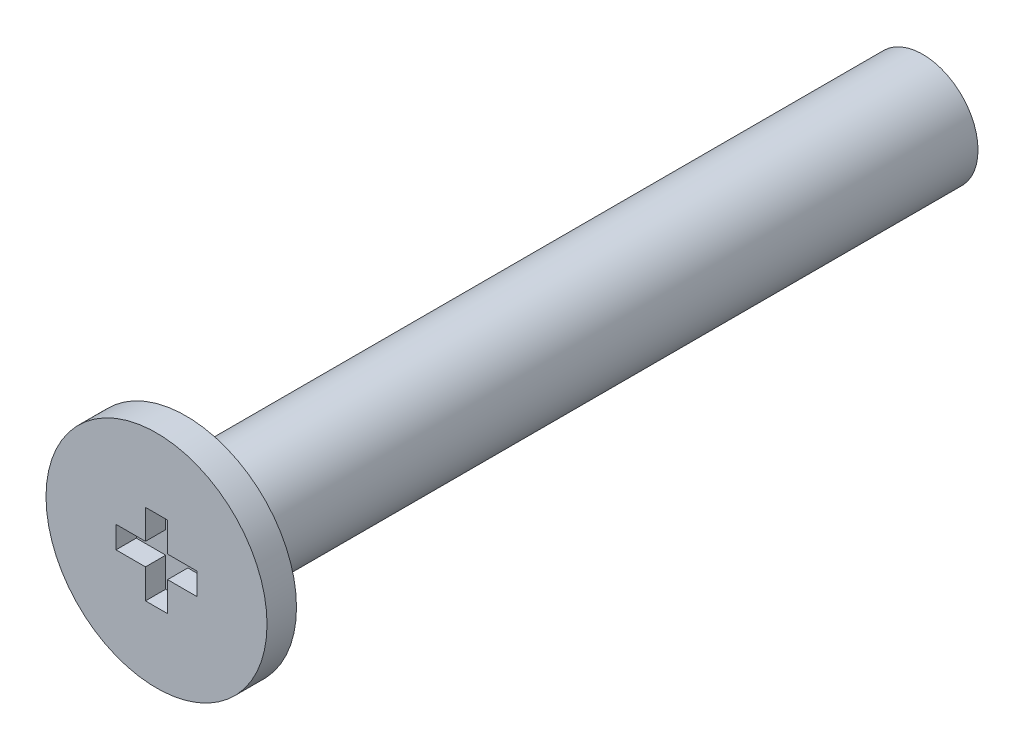
ISO-10303-21;
HEADER;
FILE_DESCRIPTION(('STEP AP214'),'2;1');
FILE_NAME('part.step','',(''),(''),'','','');
FILE_SCHEMA(('AUTOMOTIVE_DESIGN { 1 0 10303 214 1 1 1 1 }'));
ENDSEC;
DATA;
#1=APPLICATION_CONTEXT('core data for automotive mechanical design processes');
#2=APPLICATION_PROTOCOL_DEFINITION('international standard','automotive_design',2000,#1);
#3=PRODUCT_CONTEXT('',#1,'mechanical');
#4=PRODUCT('Part','Part','',(#3));
#5=PRODUCT_RELATED_PRODUCT_CATEGORY('part','',(#4));
#6=PRODUCT_DEFINITION_FORMATION('','',#4);
#7=PRODUCT_DEFINITION_CONTEXT('part definition',#1,'design');
#8=PRODUCT_DEFINITION('design','',#6,#7);
#9=PRODUCT_DEFINITION_SHAPE('','',#8);
#10=(LENGTH_UNIT() NAMED_UNIT(*) SI_UNIT(.MILLI.,.METRE.));
#11=(NAMED_UNIT(*) PLANE_ANGLE_UNIT() SI_UNIT($,.RADIAN.));
#12=(NAMED_UNIT(*) SI_UNIT($,.STERADIAN.) SOLID_ANGLE_UNIT());
#13=UNCERTAINTY_MEASURE_WITH_UNIT(LENGTH_MEASURE(1.E-05),#10,'distance_accuracy_value','');
#14=(GEOMETRIC_REPRESENTATION_CONTEXT(3) GLOBAL_UNCERTAINTY_ASSIGNED_CONTEXT((#13)) GLOBAL_UNIT_ASSIGNED_CONTEXT((#10,
#11,#12)) REPRESENTATION_CONTEXT('',''));
#15=CARTESIAN_POINT('',(0.,0.,0.));
#16=DIRECTION('',(0.,0.,1.));
#17=DIRECTION('',(1.,0.,0.));
#18=AXIS2_PLACEMENT_3D('',#15,#16,#17);
#19=CARTESIAN_POINT('',(0.,0.,-20.));
#20=DIRECTION('',(0.,0.,1.));
#21=DIRECTION('',(1.,0.,0.));
#22=AXIS2_PLACEMENT_3D('',#19,#20,#21);
#23=CYLINDRICAL_SURFACE('',#22,1.5);
#24=CARTESIAN_POINT('',(0.,0.,-20.));
#25=DIRECTION('',(0.,0.,1.));
#26=DIRECTION('',(1.,0.,0.));
#27=AXIS2_PLACEMENT_3D('',#24,#25,#26);
#28=CIRCLE('',#27,1.5);
#29=CARTESIAN_POINT('',(1.5,0.,-20.));
#30=VERTEX_POINT('',#29);
#31=EDGE_CURVE('E212',#30,#30,#28,.T.);
#32=ORIENTED_EDGE('',*,*,#31,.T.);
#33=EDGE_LOOP('',(#32));
#34=FACE_BOUND('',#33,.T.);
#35=CARTESIAN_POINT('',(0.,0.,0.));
#36=DIRECTION('',(0.,0.,1.));
#37=DIRECTION('',(1.,0.,0.));
#38=AXIS2_PLACEMENT_3D('',#35,#36,#37);
#39=CIRCLE('',#38,1.5);
#40=CARTESIAN_POINT('',(1.5,0.,0.));
#41=VERTEX_POINT('',#40);
#42=EDGE_CURVE('E208',#41,#41,#39,.T.);
#43=ORIENTED_EDGE('',*,*,#42,.F.);
#44=EDGE_LOOP('',(#43));
#45=FACE_BOUND('',#44,.T.);
#46=ADVANCED_FACE('F41',(#34,#45),#23,.T.);
#47=CARTESIAN_POINT('',(0.,0.,-20.));
#48=DIRECTION('',(0.,0.,1.));
#49=DIRECTION('',(1.,0.,0.));
#50=AXIS2_PLACEMENT_3D('',#47,#48,#49);
#51=PLANE('',#50);
#52=ORIENTED_EDGE('',*,*,#31,.F.);
#53=EDGE_LOOP('',(#52));
#54=FACE_BOUND('',#53,.T.);
#55=ADVANCED_FACE('F281',(#54),#51,.F.);
#56=CARTESIAN_POINT('',(0.,0.,0.));
#57=DIRECTION('',(0.,0.,1.));
#58=DIRECTION('',(1.,0.,0.));
#59=AXIS2_PLACEMENT_3D('',#56,#57,#58);
#60=PLANE('',#59);
#61=ORIENTED_EDGE('',*,*,#42,.T.);
#62=EDGE_LOOP('',(#61));
#63=FACE_BOUND('',#62,.T.);
#64=CARTESIAN_POINT('',(0.,0.,0.));
#65=DIRECTION('',(0.,0.,-1.));
#66=DIRECTION('',(-1.,0.,0.));
#67=AXIS2_PLACEMENT_3D('',#64,#65,#66);
#68=CIRCLE('',#67,3.);
#69=CARTESIAN_POINT('',(-3.,0.,0.));
#70=VERTEX_POINT('',#69);
#71=EDGE_CURVE('E210',#70,#70,#68,.T.);
#72=ORIENTED_EDGE('',*,*,#71,.T.);
#73=EDGE_LOOP('',(#72));
#74=FACE_BOUND('',#73,.T.);
#75=ADVANCED_FACE('F286',(#63,#74),#60,.F.);
#76=CARTESIAN_POINT('',(0.,0.,-2.));
#77=DIRECTION('',(0.,0.,-1.));
#78=DIRECTION('',(-1.,0.,0.));
#79=AXIS2_PLACEMENT_3D('',#76,#77,#78);
#80=CYLINDRICAL_SURFACE('',#79,3.);
#81=ORIENTED_EDGE('',*,*,#71,.F.);
#82=EDGE_LOOP('',(#81));
#83=FACE_BOUND('',#82,.T.);
#84=CARTESIAN_POINT('',(0.,0.,0.8));
#85=DIRECTION('',(0.,0.,-1.));
#86=DIRECTION('',(-1.,0.,0.));
#87=AXIS2_PLACEMENT_3D('',#84,#85,#86);
#88=CIRCLE('',#87,3.);
#89=CARTESIAN_POINT('',(-3.,0.,0.8));
#90=VERTEX_POINT('',#89);
#91=EDGE_CURVE('E180',#90,#90,#88,.T.);
#92=ORIENTED_EDGE('',*,*,#91,.T.);
#93=EDGE_LOOP('',(#92));
#94=FACE_BOUND('',#93,.T.);
#95=ADVANCED_FACE('F300',(#83,#94),#80,.T.);
#96=CARTESIAN_POINT('',(3.,0.,0.8));
#97=DIRECTION('',(0.,0.,-1.));
#98=DIRECTION('',(-1.,0.,0.));
#99=AXIS2_PLACEMENT_3D('',#96,#97,#98);
#100=PLANE('',#99);
#101=DIRECTION('',(-1.,0.,0.));
#102=VECTOR('',#101,1.);
#103=CARTESIAN_POINT('',(3.,-1.1,0.8));
#104=LINE('',#103,#102);
#105=CARTESIAN_POINT('',(0.3,-1.1,0.8));
#106=VERTEX_POINT('',#105);
#107=CARTESIAN_POINT('',(-0.3,-1.1,0.8));
#108=VERTEX_POINT('',#107);
#109=EDGE_CURVE('E211',#106,#108,#104,.T.);
#110=ORIENTED_EDGE('',*,*,#109,.T.);
#111=DIRECTION('',(0.,1.,0.));
#112=VECTOR('',#111,1.);
#113=CARTESIAN_POINT('',(-0.3,0.,0.8));
#114=LINE('',#113,#112);
#115=CARTESIAN_POINT('',(-0.3,-0.3,0.8));
#116=VERTEX_POINT('',#115);
#117=EDGE_CURVE('E11',#108,#116,#114,.T.);
#118=ORIENTED_EDGE('',*,*,#117,.T.);
#119=DIRECTION('',(-1.,0.,0.));
#120=VECTOR('',#119,1.);
#121=CARTESIAN_POINT('',(3.,-0.3,0.8));
#122=LINE('',#121,#120);
#123=CARTESIAN_POINT('',(-1.1,-0.3,0.8));
#124=VERTEX_POINT('',#123);
#125=EDGE_CURVE('E48',#116,#124,#122,.T.);
#126=ORIENTED_EDGE('',*,*,#125,.T.);
#127=DIRECTION('',(0.,1.,0.));
#128=VECTOR('',#127,1.);
#129=CARTESIAN_POINT('',(-1.1,0.,0.8));
#130=LINE('',#129,#128);
#131=CARTESIAN_POINT('',(-1.1,0.3,0.8));
#132=VERTEX_POINT('',#131);
#133=EDGE_CURVE('E245',#124,#132,#130,.T.);
#134=ORIENTED_EDGE('',*,*,#133,.T.);
#135=DIRECTION('',(1.,0.,0.));
#136=VECTOR('',#135,1.);
#137=CARTESIAN_POINT('',(3.,0.3,0.8));
#138=LINE('',#137,#136);
#139=CARTESIAN_POINT('',(-0.3,0.3,0.8));
#140=VERTEX_POINT('',#139);
#141=EDGE_CURVE('E236',#132,#140,#138,.T.);
#142=ORIENTED_EDGE('',*,*,#141,.T.);
#143=DIRECTION('',(0.,1.,0.));
#144=VECTOR('',#143,1.);
#145=CARTESIAN_POINT('',(-0.3,0.,0.8));
#146=LINE('',#145,#144);
#147=CARTESIAN_POINT('',(-0.3,1.1,0.8));
#148=VERTEX_POINT('',#147);
#149=EDGE_CURVE('E237',#140,#148,#146,.T.);
#150=ORIENTED_EDGE('',*,*,#149,.T.);
#151=DIRECTION('',(1.,0.,0.));
#152=VECTOR('',#151,1.);
#153=CARTESIAN_POINT('',(3.,1.1,0.8));
#154=LINE('',#153,#152);
#155=CARTESIAN_POINT('',(0.3,1.1,0.8));
#156=VERTEX_POINT('',#155);
#157=EDGE_CURVE('E231',#148,#156,#154,.T.);
#158=ORIENTED_EDGE('',*,*,#157,.T.);
#159=DIRECTION('',(0.,-1.,0.));
#160=VECTOR('',#159,1.);
#161=CARTESIAN_POINT('',(0.3,0.,0.8));
#162=LINE('',#161,#160);
#163=CARTESIAN_POINT('',(0.3,0.3,0.8));
#164=VERTEX_POINT('',#163);
#165=EDGE_CURVE('E229',#156,#164,#162,.T.);
#166=ORIENTED_EDGE('',*,*,#165,.T.);
#167=DIRECTION('',(1.,0.,0.));
#168=VECTOR('',#167,1.);
#169=CARTESIAN_POINT('',(3.,0.3,0.8));
#170=LINE('',#169,#168);
#171=CARTESIAN_POINT('',(1.1,0.3,0.8));
#172=VERTEX_POINT('',#171);
#173=EDGE_CURVE('E230',#164,#172,#170,.T.);
#174=ORIENTED_EDGE('',*,*,#173,.T.);
#175=DIRECTION('',(0.,-1.,0.));
#176=VECTOR('',#175,1.);
#177=CARTESIAN_POINT('',(1.1,0.,0.8));
#178=LINE('',#177,#176);
#179=CARTESIAN_POINT('',(1.1,-0.3,0.8));
#180=VERTEX_POINT('',#179);
#181=EDGE_CURVE('E224',#172,#180,#178,.T.);
#182=ORIENTED_EDGE('',*,*,#181,.T.);
#183=DIRECTION('',(-1.,0.,0.));
#184=VECTOR('',#183,1.);
#185=CARTESIAN_POINT('',(3.,-0.3,0.8));
#186=LINE('',#185,#184);
#187=CARTESIAN_POINT('',(0.3,-0.3,0.8));
#188=VERTEX_POINT('',#187);
#189=EDGE_CURVE('E222',#180,#188,#186,.T.);
#190=ORIENTED_EDGE('',*,*,#189,.T.);
#191=DIRECTION('',(0.,-1.,0.));
#192=VECTOR('',#191,1.);
#193=CARTESIAN_POINT('',(0.3,0.,0.8));
#194=LINE('',#193,#192);
#195=EDGE_CURVE('E217',#188,#106,#194,.T.);
#196=ORIENTED_EDGE('',*,*,#195,.T.);
#197=EDGE_LOOP('',(#110,#118,#126,#134,#142,#150,#158,#166,#174,#182,#190,#196));
#198=FACE_BOUND('',#197,.T.);
#199=ORIENTED_EDGE('',*,*,#91,.F.);
#200=EDGE_LOOP('',(#199));
#201=FACE_BOUND('',#200,.T.);
#202=ADVANCED_FACE('F244',(#198,#201),#100,.F.);
#203=CARTESIAN_POINT('',(-0.3,-0.3,0.25));
#204=DIRECTION('',(-1.,0.,0.));
#205=DIRECTION('',(0.,0.,1.));
#206=AXIS2_PLACEMENT_3D('',#203,#204,#205);
#207=PLANE('',#206);
#208=DIRECTION('',(0.,0.,1.));
#209=VECTOR('',#208,1.);
#210=CARTESIAN_POINT('',(-0.3,-1.1,0.25));
#211=LINE('',#210,#209);
#212=CARTESIAN_POINT('',(-0.3,-1.1,0.25));
#213=VERTEX_POINT('',#212);
#214=EDGE_CURVE('E54',#213,#108,#211,.T.);
#215=ORIENTED_EDGE('',*,*,#214,.F.);
#216=DIRECTION('',(0.,-1.,0.));
#217=VECTOR('',#216,1.);
#218=CARTESIAN_POINT('',(-0.3,-0.3,0.25));
#219=LINE('',#218,#217);
#220=CARTESIAN_POINT('',(-0.3,-0.3,0.25));
#221=VERTEX_POINT('',#220);
#222=EDGE_CURVE('E129',#221,#213,#219,.T.);
#223=ORIENTED_EDGE('',*,*,#222,.F.);
#224=DIRECTION('',(0.,0.,1.));
#225=VECTOR('',#224,1.);
#226=CARTESIAN_POINT('',(-0.3,-0.3,0.25));
#227=LINE('',#226,#225);
#228=EDGE_CURVE('E171',#221,#116,#227,.T.);
#229=ORIENTED_EDGE('',*,*,#228,.T.);
#230=ORIENTED_EDGE('',*,*,#117,.F.);
#231=EDGE_LOOP('',(#215,#223,#229,#230));
#232=FACE_BOUND('',#231,.T.);
#233=ADVANCED_FACE('F127',(#232),#207,.F.);
#234=CARTESIAN_POINT('',(-1.1,-0.3,0.25));
#235=DIRECTION('',(0.,-1.,0.));
#236=DIRECTION('',(0.,0.,-1.));
#237=AXIS2_PLACEMENT_3D('',#234,#235,#236);
#238=PLANE('',#237);
#239=ORIENTED_EDGE('',*,*,#228,.F.);
#240=DIRECTION('',(1.,0.,0.));
#241=VECTOR('',#240,1.);
#242=CARTESIAN_POINT('',(-1.1,-0.3,0.25));
#243=LINE('',#242,#241);
#244=CARTESIAN_POINT('',(-1.1,-0.3,0.25));
#245=VERTEX_POINT('',#244);
#246=EDGE_CURVE('E131',#245,#221,#243,.T.);
#247=ORIENTED_EDGE('',*,*,#246,.F.);
#248=DIRECTION('',(0.,0.,1.));
#249=VECTOR('',#248,1.);
#250=CARTESIAN_POINT('',(-1.1,-0.3,0.25));
#251=LINE('',#250,#249);
#252=EDGE_CURVE('E177',#245,#124,#251,.T.);
#253=ORIENTED_EDGE('',*,*,#252,.T.);
#254=ORIENTED_EDGE('',*,*,#125,.F.);
#255=EDGE_LOOP('',(#239,#247,#253,#254));
#256=FACE_BOUND('',#255,.T.);
#257=ADVANCED_FACE('F273',(#256),#238,.F.);
#258=CARTESIAN_POINT('',(-1.1,0.3,0.25));
#259=DIRECTION('',(-1.,0.,0.));
#260=DIRECTION('',(0.,0.,1.));
#261=AXIS2_PLACEMENT_3D('',#258,#259,#260);
#262=PLANE('',#261);
#263=ORIENTED_EDGE('',*,*,#252,.F.);
#264=DIRECTION('',(0.,-1.,0.));
#265=VECTOR('',#264,1.);
#266=CARTESIAN_POINT('',(-1.1,0.3,0.25));
#267=LINE('',#266,#265);
#268=CARTESIAN_POINT('',(-1.1,0.3,0.25));
#269=VERTEX_POINT('',#268);
#270=EDGE_CURVE('E175',#269,#245,#267,.T.);
#271=ORIENTED_EDGE('',*,*,#270,.F.);
#272=DIRECTION('',(0.,0.,1.));
#273=VECTOR('',#272,1.);
#274=CARTESIAN_POINT('',(-1.1,0.3,0.25));
#275=LINE('',#274,#273);
#276=EDGE_CURVE('E179',#269,#132,#275,.T.);
#277=ORIENTED_EDGE('',*,*,#276,.T.);
#278=ORIENTED_EDGE('',*,*,#133,.F.);
#279=EDGE_LOOP('',(#263,#271,#277,#278));
#280=FACE_BOUND('',#279,.T.);
#281=ADVANCED_FACE('F275',(#280),#262,.F.);
#282=CARTESIAN_POINT('',(-0.3,0.3,0.25));
#283=DIRECTION('',(0.,1.,0.));
#284=DIRECTION('',(0.,0.,1.));
#285=AXIS2_PLACEMENT_3D('',#282,#283,#284);
#286=PLANE('',#285);
#287=ORIENTED_EDGE('',*,*,#276,.F.);
#288=DIRECTION('',(-1.,0.,0.));
#289=VECTOR('',#288,1.);
#290=CARTESIAN_POINT('',(-0.3,0.3,0.25));
#291=LINE('',#290,#289);
#292=CARTESIAN_POINT('',(-0.3,0.3,0.25));
#293=VERTEX_POINT('',#292);
#294=EDGE_CURVE('E168',#293,#269,#291,.T.);
#295=ORIENTED_EDGE('',*,*,#294,.F.);
#296=DIRECTION('',(0.,0.,1.));
#297=VECTOR('',#296,1.);
#298=CARTESIAN_POINT('',(-0.3,0.3,0.25));
#299=LINE('',#298,#297);
#300=EDGE_CURVE('E181',#293,#140,#299,.T.);
#301=ORIENTED_EDGE('',*,*,#300,.T.);
#302=ORIENTED_EDGE('',*,*,#141,.F.);
#303=EDGE_LOOP('',(#287,#295,#301,#302));
#304=FACE_BOUND('',#303,.T.);
#305=ADVANCED_FACE('F269',(#304),#286,.F.);
#306=CARTESIAN_POINT('',(-0.3,1.1,0.25));
#307=DIRECTION('',(-1.,0.,0.));
#308=DIRECTION('',(0.,0.,1.));
#309=AXIS2_PLACEMENT_3D('',#306,#307,#308);
#310=PLANE('',#309);
#311=ORIENTED_EDGE('',*,*,#300,.F.);
#312=DIRECTION('',(0.,-1.,0.));
#313=VECTOR('',#312,1.);
#314=CARTESIAN_POINT('',(-0.3,1.1,0.25));
#315=LINE('',#314,#313);
#316=CARTESIAN_POINT('',(-0.3,1.1,0.25));
#317=VERTEX_POINT('',#316);
#318=EDGE_CURVE('E166',#317,#293,#315,.T.);
#319=ORIENTED_EDGE('',*,*,#318,.F.);
#320=DIRECTION('',(0.,0.,1.));
#321=VECTOR('',#320,1.);
#322=CARTESIAN_POINT('',(-0.3,1.1,0.25));
#323=LINE('',#322,#321);
#324=EDGE_CURVE('E188',#317,#148,#323,.T.);
#325=ORIENTED_EDGE('',*,*,#324,.T.);
#326=ORIENTED_EDGE('',*,*,#149,.F.);
#327=EDGE_LOOP('',(#311,#319,#325,#326));
#328=FACE_BOUND('',#327,.T.);
#329=ADVANCED_FACE('F266',(#328),#310,.F.);
#330=CARTESIAN_POINT('',(0.3,1.1,0.25));
#331=DIRECTION('',(0.,1.,0.));
#332=DIRECTION('',(0.,0.,1.));
#333=AXIS2_PLACEMENT_3D('',#330,#331,#332);
#334=PLANE('',#333);
#335=ORIENTED_EDGE('',*,*,#324,.F.);
#336=DIRECTION('',(-1.,0.,0.));
#337=VECTOR('',#336,1.);
#338=CARTESIAN_POINT('',(0.3,1.1,0.25));
#339=LINE('',#338,#337);
#340=CARTESIAN_POINT('',(0.3,1.1,0.25));
#341=VERTEX_POINT('',#340);
#342=EDGE_CURVE('E164',#341,#317,#339,.T.);
#343=ORIENTED_EDGE('',*,*,#342,.F.);
#344=DIRECTION('',(0.,0.,1.));
#345=VECTOR('',#344,1.);
#346=CARTESIAN_POINT('',(0.3,1.1,0.25));
#347=LINE('',#346,#345);
#348=EDGE_CURVE('E189',#341,#156,#347,.T.);
#349=ORIENTED_EDGE('',*,*,#348,.T.);
#350=ORIENTED_EDGE('',*,*,#157,.F.);
#351=EDGE_LOOP('',(#335,#343,#349,#350));
#352=FACE_BOUND('',#351,.T.);
#353=ADVANCED_FACE('F261',(#352),#334,.F.);
#354=CARTESIAN_POINT('',(0.3,0.3,0.25));
#355=DIRECTION('',(1.,0.,0.));
#356=DIRECTION('',(0.,0.,-1.));
#357=AXIS2_PLACEMENT_3D('',#354,#355,#356);
#358=PLANE('',#357);
#359=ORIENTED_EDGE('',*,*,#348,.F.);
#360=DIRECTION('',(0.,1.,0.));
#361=VECTOR('',#360,1.);
#362=CARTESIAN_POINT('',(0.3,0.3,0.25));
#363=LINE('',#362,#361);
#364=CARTESIAN_POINT('',(0.3,0.3,0.25));
#365=VERTEX_POINT('',#364);
#366=EDGE_CURVE('E158',#365,#341,#363,.T.);
#367=ORIENTED_EDGE('',*,*,#366,.F.);
#368=DIRECTION('',(0.,0.,1.));
#369=VECTOR('',#368,1.);
#370=CARTESIAN_POINT('',(0.3,0.3,0.25));
#371=LINE('',#370,#369);
#372=EDGE_CURVE('E195',#365,#164,#371,.T.);
#373=ORIENTED_EDGE('',*,*,#372,.T.);
#374=ORIENTED_EDGE('',*,*,#165,.F.);
#375=EDGE_LOOP('',(#359,#367,#373,#374));
#376=FACE_BOUND('',#375,.T.);
#377=ADVANCED_FACE('F263',(#376),#358,.F.);
#378=CARTESIAN_POINT('',(1.1,0.3,0.25));
#379=DIRECTION('',(0.,1.,0.));
#380=DIRECTION('',(0.,0.,1.));
#381=AXIS2_PLACEMENT_3D('',#378,#379,#380);
#382=PLANE('',#381);
#383=ORIENTED_EDGE('',*,*,#372,.F.);
#384=DIRECTION('',(-1.,0.,0.));
#385=VECTOR('',#384,1.);
#386=CARTESIAN_POINT('',(1.1,0.3,0.25));
#387=LINE('',#386,#385);
#388=CARTESIAN_POINT('',(1.1,0.3,0.25));
#389=VERTEX_POINT('',#388);
#390=EDGE_CURVE('E160',#389,#365,#387,.T.);
#391=ORIENTED_EDGE('',*,*,#390,.F.);
#392=DIRECTION('',(0.,0.,1.));
#393=VECTOR('',#392,1.);
#394=CARTESIAN_POINT('',(1.1,0.3,0.25));
#395=LINE('',#394,#393);
#396=EDGE_CURVE('E194',#389,#172,#395,.T.);
#397=ORIENTED_EDGE('',*,*,#396,.T.);
#398=ORIENTED_EDGE('',*,*,#173,.F.);
#399=EDGE_LOOP('',(#383,#391,#397,#398));
#400=FACE_BOUND('',#399,.T.);
#401=ADVANCED_FACE('F257',(#400),#382,.F.);
#402=CARTESIAN_POINT('',(1.1,-0.3,0.25));
#403=DIRECTION('',(1.,0.,0.));
#404=DIRECTION('',(0.,0.,-1.));
#405=AXIS2_PLACEMENT_3D('',#402,#403,#404);
#406=PLANE('',#405);
#407=ORIENTED_EDGE('',*,*,#396,.F.);
#408=DIRECTION('',(0.,1.,0.));
#409=VECTOR('',#408,1.);
#410=CARTESIAN_POINT('',(1.1,-0.3,0.25));
#411=LINE('',#410,#409);
#412=CARTESIAN_POINT('',(1.1,-0.3,0.25));
#413=VERTEX_POINT('',#412);
#414=EDGE_CURVE('E153',#413,#389,#411,.T.);
#415=ORIENTED_EDGE('',*,*,#414,.F.);
#416=DIRECTION('',(0.,0.,1.));
#417=VECTOR('',#416,1.);
#418=CARTESIAN_POINT('',(1.1,-0.3,0.25));
#419=LINE('',#418,#417);
#420=EDGE_CURVE('E198',#413,#180,#419,.T.);
#421=ORIENTED_EDGE('',*,*,#420,.T.);
#422=ORIENTED_EDGE('',*,*,#181,.F.);
#423=EDGE_LOOP('',(#407,#415,#421,#422));
#424=FACE_BOUND('',#423,.T.);
#425=ADVANCED_FACE('F253',(#424),#406,.F.);
#426=CARTESIAN_POINT('',(0.3,-0.3,0.25));
#427=DIRECTION('',(0.,-1.,0.));
#428=DIRECTION('',(0.,0.,-1.));
#429=AXIS2_PLACEMENT_3D('',#426,#427,#428);
#430=PLANE('',#429);
#431=ORIENTED_EDGE('',*,*,#420,.F.);
#432=DIRECTION('',(1.,0.,0.));
#433=VECTOR('',#432,1.);
#434=CARTESIAN_POINT('',(0.3,-0.3,0.25));
#435=LINE('',#434,#433);
#436=CARTESIAN_POINT('',(0.3,-0.3,0.25));
#437=VERTEX_POINT('',#436);
#438=EDGE_CURVE('E151',#437,#413,#435,.T.);
#439=ORIENTED_EDGE('',*,*,#438,.F.);
#440=DIRECTION('',(0.,0.,1.));
#441=VECTOR('',#440,1.);
#442=CARTESIAN_POINT('',(0.3,-0.3,0.25));
#443=LINE('',#442,#441);
#444=EDGE_CURVE('E201',#437,#188,#443,.T.);
#445=ORIENTED_EDGE('',*,*,#444,.T.);
#446=ORIENTED_EDGE('',*,*,#189,.F.);
#447=EDGE_LOOP('',(#431,#439,#445,#446));
#448=FACE_BOUND('',#447,.T.);
#449=ADVANCED_FACE('F255',(#448),#430,.F.);
#450=CARTESIAN_POINT('',(0.3,-1.1,0.25));
#451=DIRECTION('',(1.,0.,0.));
#452=DIRECTION('',(0.,0.,-1.));
#453=AXIS2_PLACEMENT_3D('',#450,#451,#452);
#454=PLANE('',#453);
#455=ORIENTED_EDGE('',*,*,#444,.F.);
#456=DIRECTION('',(0.,1.,0.));
#457=VECTOR('',#456,1.);
#458=CARTESIAN_POINT('',(0.3,-1.1,0.25));
#459=LINE('',#458,#457);
#460=CARTESIAN_POINT('',(0.3,-1.1,0.25));
#461=VERTEX_POINT('',#460);
#462=EDGE_CURVE('E142',#461,#437,#459,.T.);
#463=ORIENTED_EDGE('',*,*,#462,.F.);
#464=DIRECTION('',(0.,0.,1.));
#465=VECTOR('',#464,1.);
#466=CARTESIAN_POINT('',(0.3,-1.1,0.25));
#467=LINE('',#466,#465);
#468=EDGE_CURVE('E134',#461,#106,#467,.T.);
#469=ORIENTED_EDGE('',*,*,#468,.T.);
#470=ORIENTED_EDGE('',*,*,#195,.F.);
#471=EDGE_LOOP('',(#455,#463,#469,#470));
#472=FACE_BOUND('',#471,.T.);
#473=ADVANCED_FACE('F248',(#472),#454,.F.);
#474=CARTESIAN_POINT('',(-0.3,-1.1,0.25));
#475=DIRECTION('',(0.,-1.,0.));
#476=DIRECTION('',(0.,0.,-1.));
#477=AXIS2_PLACEMENT_3D('',#474,#475,#476);
#478=PLANE('',#477);
#479=ORIENTED_EDGE('',*,*,#468,.F.);
#480=DIRECTION('',(1.,0.,0.));
#481=VECTOR('',#480,1.);
#482=CARTESIAN_POINT('',(-0.3,-1.1,0.25));
#483=LINE('',#482,#481);
#484=EDGE_CURVE('E140',#213,#461,#483,.T.);
#485=ORIENTED_EDGE('',*,*,#484,.F.);
#486=ORIENTED_EDGE('',*,*,#214,.T.);
#487=ORIENTED_EDGE('',*,*,#109,.F.);
#488=EDGE_LOOP('',(#479,#485,#486,#487));
#489=FACE_BOUND('',#488,.T.);
#490=ADVANCED_FACE('F139',(#489),#478,.F.);
#491=CARTESIAN_POINT('',(0.,0.,0.25));
#492=DIRECTION('',(0.,0.,1.));
#493=DIRECTION('',(1.,0.,0.));
#494=AXIS2_PLACEMENT_3D('',#491,#492,#493);
#495=PLANE('',#494);
#496=ORIENTED_EDGE('',*,*,#222,.T.);
#497=ORIENTED_EDGE('',*,*,#484,.T.);
#498=ORIENTED_EDGE('',*,*,#462,.T.);
#499=ORIENTED_EDGE('',*,*,#438,.T.);
#500=ORIENTED_EDGE('',*,*,#414,.T.);
#501=ORIENTED_EDGE('',*,*,#390,.T.);
#502=ORIENTED_EDGE('',*,*,#366,.T.);
#503=ORIENTED_EDGE('',*,*,#342,.T.);
#504=ORIENTED_EDGE('',*,*,#318,.T.);
#505=ORIENTED_EDGE('',*,*,#294,.T.);
#506=ORIENTED_EDGE('',*,*,#270,.T.);
#507=ORIENTED_EDGE('',*,*,#246,.T.);
#508=EDGE_LOOP('',(#496,#497,#498,#499,#500,#501,#502,#503,#504,#505,#506,#507));
#509=FACE_BOUND('',#508,.T.);
#510=ADVANCED_FACE('F144',(#509),#495,.T.);
#511=CLOSED_SHELL('',(#46,#55,#75,#95,#202,#233,#257,#281,#305,#329,#353,#377,#401,#425,#449,
#473,#490,#510));
#512=MANIFOLD_SOLID_BREP('B2',#511);
#513=ADVANCED_BREP_SHAPE_REPRESENTATION('',(#18,#512),#14);
#514=SHAPE_DEFINITION_REPRESENTATION(#9,#513);
ENDSEC;
END-ISO-10303-21;
